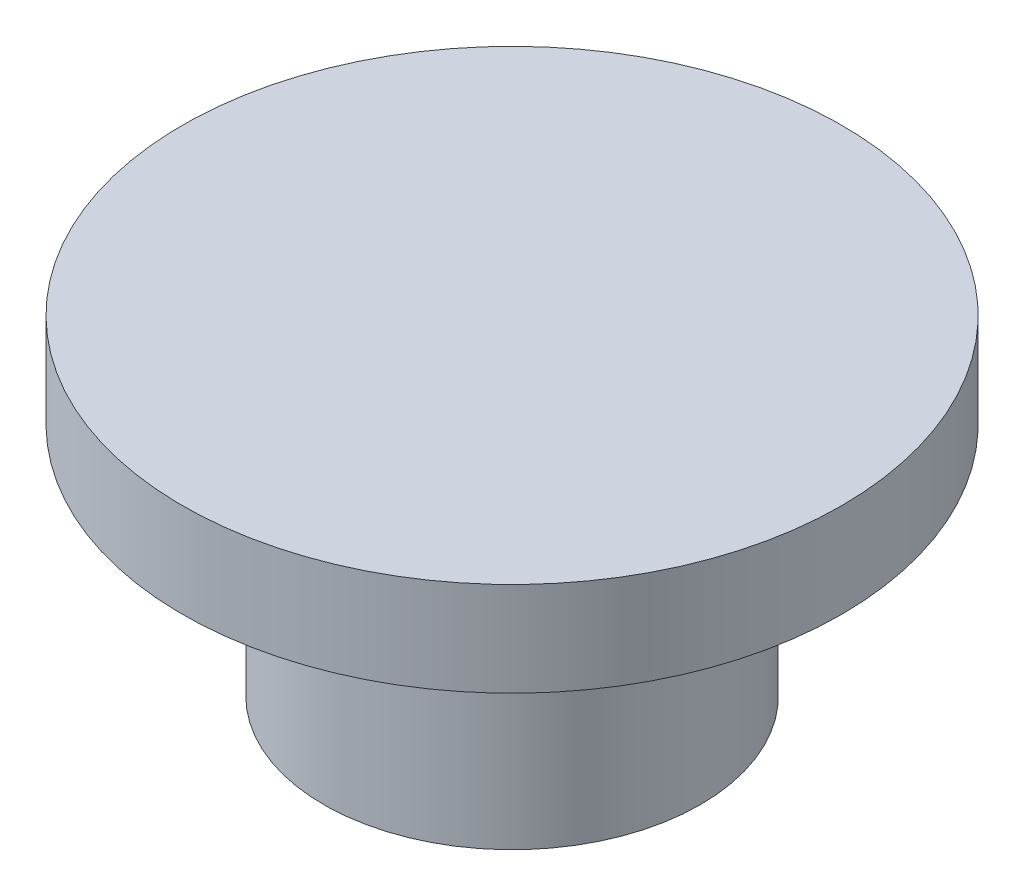
ISO-10303-21;
HEADER;
FILE_DESCRIPTION(('STEP AP214'),'2;1');
FILE_NAME('part.step','',(''),(''),'','','');
FILE_SCHEMA(('AUTOMOTIVE_DESIGN { 1 0 10303 214 1 1 1 1 }'));
ENDSEC;
DATA;
#1=APPLICATION_CONTEXT('core data for automotive mechanical design processes');
#2=APPLICATION_PROTOCOL_DEFINITION('international standard','automotive_design',2000,#1);
#3=PRODUCT_CONTEXT('',#1,'mechanical');
#4=PRODUCT('Part','Part','',(#3));
#5=PRODUCT_RELATED_PRODUCT_CATEGORY('part','',(#4));
#6=PRODUCT_DEFINITION_FORMATION('','',#4);
#7=PRODUCT_DEFINITION_CONTEXT('part definition',#1,'design');
#8=PRODUCT_DEFINITION('design','',#6,#7);
#9=PRODUCT_DEFINITION_SHAPE('','',#8);
#10=(LENGTH_UNIT() NAMED_UNIT(*) SI_UNIT(.MILLI.,.METRE.));
#11=(NAMED_UNIT(*) PLANE_ANGLE_UNIT() SI_UNIT($,.RADIAN.));
#12=(NAMED_UNIT(*) SI_UNIT($,.STERADIAN.) SOLID_ANGLE_UNIT());
#13=UNCERTAINTY_MEASURE_WITH_UNIT(LENGTH_MEASURE(1.E-05),#10,'distance_accuracy_value','');
#14=(GEOMETRIC_REPRESENTATION_CONTEXT(3) GLOBAL_UNCERTAINTY_ASSIGNED_CONTEXT((#13)) GLOBAL_UNIT_ASSIGNED_CONTEXT((#10,
#11,#12)) REPRESENTATION_CONTEXT('',''));
#15=CARTESIAN_POINT('',(0.,0.,0.));
#16=DIRECTION('',(0.,0.,1.));
#17=DIRECTION('',(1.,0.,0.));
#18=AXIS2_PLACEMENT_3D('',#15,#16,#17);
#19=CARTESIAN_POINT('',(0.,35.,0.));
#20=DIRECTION('',(0.,1.,0.));
#21=DIRECTION('',(-1.,0.,0.));
#22=AXIS2_PLACEMENT_3D('',#19,#20,#21);
#23=PLANE('',#22);
#24=CARTESIAN_POINT('',(0.,35.,0.));
#25=DIRECTION('',(0.,-1.,0.));
#26=DIRECTION('',(1.,0.,0.));
#27=AXIS2_PLACEMENT_3D('',#24,#25,#26);
#28=CIRCLE('',#27,35.);
#29=CARTESIAN_POINT('',(35.,35.,0.));
#30=VERTEX_POINT('',#29);
#31=EDGE_CURVE('E10',#30,#30,#28,.T.);
#32=ORIENTED_EDGE('',*,*,#31,.F.);
#33=EDGE_LOOP('',(#32));
#34=FACE_BOUND('',#33,.T.);
#35=ADVANCED_FACE('F33',(#34),#23,.T.);
#36=CARTESIAN_POINT('',(0.,0.,0.));
#37=DIRECTION('',(0.,-1.,0.));
#38=DIRECTION('',(1.,0.,0.));
#39=AXIS2_PLACEMENT_3D('',#36,#37,#38);
#40=CYLINDRICAL_SURFACE('',#39,35.);
#41=ORIENTED_EDGE('',*,*,#31,.T.);
#42=EDGE_LOOP('',(#41));
#43=FACE_BOUND('',#42,.T.);
#44=CARTESIAN_POINT('',(0.,25.,0.));
#45=DIRECTION('',(0.,-1.,0.));
#46=DIRECTION('',(1.,0.,0.));
#47=AXIS2_PLACEMENT_3D('',#44,#45,#46);
#48=CIRCLE('',#47,35.);
#49=CARTESIAN_POINT('',(35.,25.,0.));
#50=VERTEX_POINT('',#49);
#51=EDGE_CURVE('E39',#50,#50,#48,.T.);
#52=ORIENTED_EDGE('',*,*,#51,.F.);
#53=EDGE_LOOP('',(#52));
#54=FACE_BOUND('',#53,.T.);
#55=ADVANCED_FACE('F81',(#43,#54),#40,.T.);
#56=CARTESIAN_POINT('',(35.,25.,0.));
#57=DIRECTION('',(0.,-1.,0.));
#58=DIRECTION('',(1.,0.,0.));
#59=AXIS2_PLACEMENT_3D('',#56,#57,#58);
#60=PLANE('',#59);
#61=ORIENTED_EDGE('',*,*,#51,.T.);
#62=EDGE_LOOP('',(#61));
#63=FACE_BOUND('',#62,.T.);
#64=CARTESIAN_POINT('',(0.,25.,0.));
#65=DIRECTION('',(0.,-1.,0.));
#66=DIRECTION('',(1.,0.,0.));
#67=AXIS2_PLACEMENT_3D('',#64,#65,#66);
#68=CIRCLE('',#67,20.);
#69=CARTESIAN_POINT('',(20.,25.,0.));
#70=VERTEX_POINT('',#69);
#71=EDGE_CURVE('E43',#70,#70,#68,.T.);
#72=ORIENTED_EDGE('',*,*,#71,.F.);
#73=EDGE_LOOP('',(#72));
#74=FACE_BOUND('',#73,.T.);
#75=ADVANCED_FACE('F75',(#63,#74),#60,.T.);
#76=CARTESIAN_POINT('',(0.,0.,0.));
#77=DIRECTION('',(0.,-1.,0.));
#78=DIRECTION('',(1.,0.,0.));
#79=AXIS2_PLACEMENT_3D('',#76,#77,#78);
#80=CYLINDRICAL_SURFACE('',#79,20.);
#81=ORIENTED_EDGE('',*,*,#71,.T.);
#82=EDGE_LOOP('',(#81));
#83=FACE_BOUND('',#82,.T.);
#84=CARTESIAN_POINT('',(0.,0.,0.));
#85=DIRECTION('',(0.,-1.,0.));
#86=DIRECTION('',(1.,0.,0.));
#87=AXIS2_PLACEMENT_3D('',#84,#85,#86);
#88=CIRCLE('',#87,20.);
#89=CARTESIAN_POINT('',(20.,0.,0.));
#90=VERTEX_POINT('',#89);
#91=EDGE_CURVE('E47',#90,#90,#88,.T.);
#92=ORIENTED_EDGE('',*,*,#91,.F.);
#93=EDGE_LOOP('',(#92));
#94=FACE_BOUND('',#93,.T.);
#95=ADVANCED_FACE('F70',(#83,#94),#80,.T.);
#96=CARTESIAN_POINT('',(20.,0.,0.));
#97=DIRECTION('',(0.,-1.,0.));
#98=DIRECTION('',(1.,0.,0.));
#99=AXIS2_PLACEMENT_3D('',#96,#97,#98);
#100=PLANE('',#99);
#101=CARTESIAN_POINT('',(0.,0.,0.));
#102=DIRECTION('',(0.,-1.,0.));
#103=DIRECTION('',(1.,0.,0.));
#104=AXIS2_PLACEMENT_3D('',#101,#102,#103);
#105=CIRCLE('',#104,15.);
#106=CARTESIAN_POINT('',(15.,0.,0.));
#107=VERTEX_POINT('',#106);
#108=EDGE_CURVE('E53',#107,#107,#105,.T.);
#109=ORIENTED_EDGE('',*,*,#108,.F.);
#110=EDGE_LOOP('',(#109));
#111=FACE_BOUND('',#110,.T.);
#112=ORIENTED_EDGE('',*,*,#91,.T.);
#113=EDGE_LOOP('',(#112));
#114=FACE_BOUND('',#113,.T.);
#115=ADVANCED_FACE('F67',(#111,#114),#100,.T.);
#116=CARTESIAN_POINT('',(0.,30.,0.));
#117=DIRECTION('',(0.,1.,0.));
#118=DIRECTION('',(-1.,0.,0.));
#119=AXIS2_PLACEMENT_3D('',#116,#117,#118);
#120=PLANE('',#119);
#121=CARTESIAN_POINT('',(0.,30.,0.));
#122=DIRECTION('',(0.,-1.,0.));
#123=DIRECTION('',(1.,0.,0.));
#124=AXIS2_PLACEMENT_3D('',#121,#122,#123);
#125=CIRCLE('',#124,15.);
#126=CARTESIAN_POINT('',(15.,30.,0.));
#127=VERTEX_POINT('',#126);
#128=EDGE_CURVE('E52',#127,#127,#125,.T.);
#129=ORIENTED_EDGE('',*,*,#128,.T.);
#130=EDGE_LOOP('',(#129));
#131=FACE_BOUND('',#130,.T.);
#132=ADVANCED_FACE('F59',(#131),#120,.F.);
#133=CARTESIAN_POINT('',(0.,0.,0.));
#134=DIRECTION('',(0.,-1.,0.));
#135=DIRECTION('',(1.,0.,0.));
#136=AXIS2_PLACEMENT_3D('',#133,#134,#135);
#137=CYLINDRICAL_SURFACE('',#136,15.);
#138=ORIENTED_EDGE('',*,*,#128,.F.);
#139=EDGE_LOOP('',(#138));
#140=FACE_BOUND('',#139,.T.);
#141=ORIENTED_EDGE('',*,*,#108,.T.);
#142=EDGE_LOOP('',(#141));
#143=FACE_BOUND('',#142,.T.);
#144=ADVANCED_FACE('F61',(#140,#143),#137,.F.);
#145=CLOSED_SHELL('',(#35,#55,#75,#95,#115,#132,#144));
#146=MANIFOLD_SOLID_BREP('B2',#145);
#147=ADVANCED_BREP_SHAPE_REPRESENTATION('',(#18,#146),#14);
#148=SHAPE_DEFINITION_REPRESENTATION(#9,#147);
ENDSEC;
END-ISO-10303-21;
